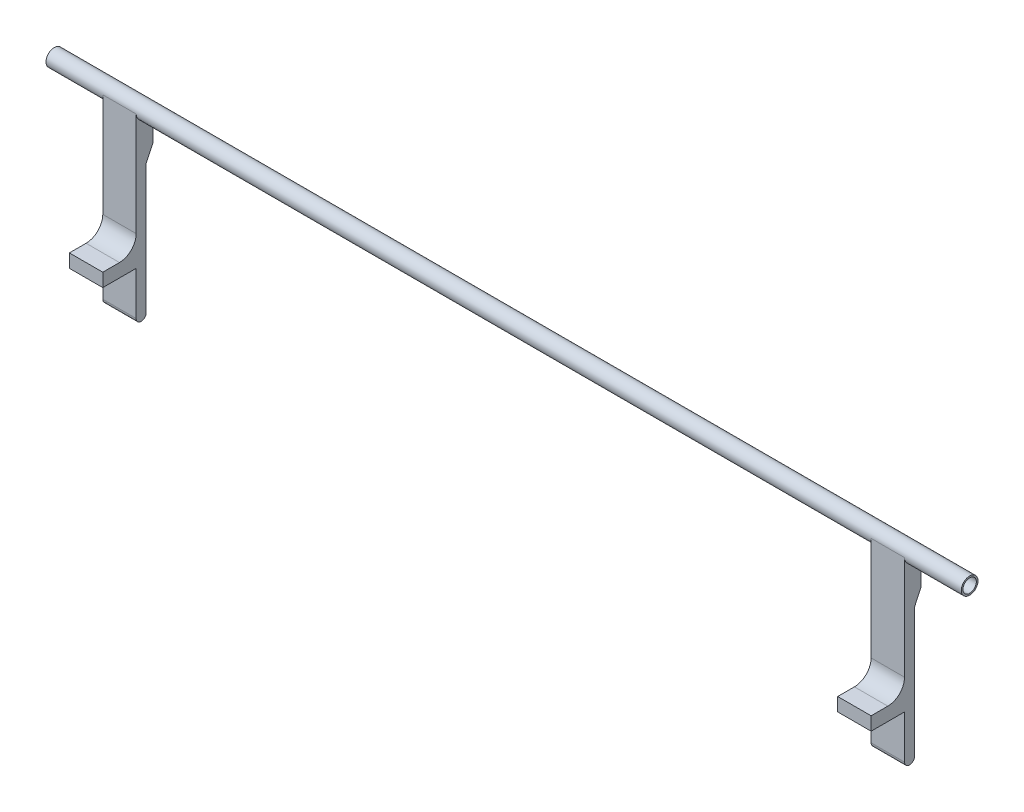
ISO-10303-21;
HEADER;
FILE_DESCRIPTION(('STEP AP214'),'2;1');
FILE_NAME('part.step','',(''),(''),'','','');
FILE_SCHEMA(('AUTOMOTIVE_DESIGN { 1 0 10303 214 1 1 1 1 }'));
ENDSEC;
DATA;
#1=APPLICATION_CONTEXT('core data for automotive mechanical design processes');
#2=APPLICATION_PROTOCOL_DEFINITION('international standard','automotive_design',2000,#1);
#3=PRODUCT_CONTEXT('',#1,'mechanical');
#4=PRODUCT('Part','Part','',(#3));
#5=PRODUCT_RELATED_PRODUCT_CATEGORY('part','',(#4));
#6=PRODUCT_DEFINITION_FORMATION('','',#4);
#7=PRODUCT_DEFINITION_CONTEXT('part definition',#1,'design');
#8=PRODUCT_DEFINITION('design','',#6,#7);
#9=PRODUCT_DEFINITION_SHAPE('','',#8);
#10=(LENGTH_UNIT() NAMED_UNIT(*) SI_UNIT(.MILLI.,.METRE.));
#11=(NAMED_UNIT(*) PLANE_ANGLE_UNIT() SI_UNIT($,.RADIAN.));
#12=(NAMED_UNIT(*) SI_UNIT($,.STERADIAN.) SOLID_ANGLE_UNIT());
#13=UNCERTAINTY_MEASURE_WITH_UNIT(LENGTH_MEASURE(1.E-05),#10,'distance_accuracy_value','');
#14=(GEOMETRIC_REPRESENTATION_CONTEXT(3) GLOBAL_UNCERTAINTY_ASSIGNED_CONTEXT((#13)) GLOBAL_UNIT_ASSIGNED_CONTEXT((#10,
#11,#12)) REPRESENTATION_CONTEXT('',''));
#15=CARTESIAN_POINT('',(0.,0.,0.));
#16=DIRECTION('',(0.,0.,1.));
#17=DIRECTION('',(1.,0.,0.));
#18=AXIS2_PLACEMENT_3D('',#15,#16,#17);
#19=CARTESIAN_POINT('',(137.,0.,0.));
#20=DIRECTION('',(-1.,0.,0.));
#21=DIRECTION('',(0.,0.,1.));
#22=AXIS2_PLACEMENT_3D('',#19,#20,#21);
#23=CYLINDRICAL_SURFACE('',#22,2.5);
#24=CARTESIAN_POINT('',(110.,0.,0.));
#25=DIRECTION('',(-1.,0.,0.));
#26=DIRECTION('',(0.,0.,-1.));
#27=AXIS2_PLACEMENT_3D('',#24,#25,#26);
#28=CIRCLE('',#27,2.5);
#29=CARTESIAN_POINT('',(110.,0.,-2.5));
#30=VERTEX_POINT('',#29);
#31=CARTESIAN_POINT('',(110.,0.,2.5));
#32=VERTEX_POINT('',#31);
#33=EDGE_CURVE('E274',#30,#32,#28,.T.);
#34=ORIENTED_EDGE('',*,*,#33,.T.);
#35=DIRECTION('',(1.,0.,0.));
#36=VECTOR('',#35,1.);
#37=CARTESIAN_POINT('',(110.,0.,2.5));
#38=LINE('',#37,#36);
#39=CARTESIAN_POINT('',(120.,0.,2.5));
#40=VERTEX_POINT('',#39);
#41=EDGE_CURVE('E307',#32,#40,#38,.T.);
#42=ORIENTED_EDGE('',*,*,#41,.T.);
#43=CARTESIAN_POINT('',(120.,0.,0.));
#44=DIRECTION('',(-1.,0.,0.));
#45=DIRECTION('',(0.,0.,-1.));
#46=AXIS2_PLACEMENT_3D('',#43,#44,#45);
#47=CIRCLE('',#46,2.5);
#48=CARTESIAN_POINT('',(120.,0.,-2.5));
#49=VERTEX_POINT('',#48);
#50=EDGE_CURVE('E248',#49,#40,#47,.T.);
#51=ORIENTED_EDGE('',*,*,#50,.F.);
#52=DIRECTION('',(1.,0.,0.));
#53=VECTOR('',#52,1.);
#54=CARTESIAN_POINT('',(110.,0.,-2.5));
#55=LINE('',#54,#53);
#56=EDGE_CURVE('E336',#30,#49,#55,.T.);
#57=ORIENTED_EDGE('',*,*,#56,.F.);
#58=EDGE_LOOP('',(#34,#42,#51,#57));
#59=FACE_BOUND('',#58,.T.);
#60=CARTESIAN_POINT('',(137.,0.,0.));
#61=DIRECTION('',(1.,0.,0.));
#62=DIRECTION('',(0.,0.,-1.));
#63=AXIS2_PLACEMENT_3D('',#60,#61,#62);
#64=CIRCLE('',#63,2.5);
#65=CARTESIAN_POINT('',(137.,0.,-2.5));
#66=VERTEX_POINT('',#65);
#67=EDGE_CURVE('E11',#66,#66,#64,.T.);
#68=ORIENTED_EDGE('',*,*,#67,.F.);
#69=EDGE_LOOP('',(#68));
#70=FACE_BOUND('',#69,.T.);
#71=CARTESIAN_POINT('',(-137.,0.,0.));
#72=DIRECTION('',(1.,0.,0.));
#73=DIRECTION('',(0.,0.,-1.));
#74=AXIS2_PLACEMENT_3D('',#71,#72,#73);
#75=CIRCLE('',#74,2.5);
#76=CARTESIAN_POINT('',(-137.,0.,-2.5));
#77=VERTEX_POINT('',#76);
#78=EDGE_CURVE('E39',#77,#77,#75,.T.);
#79=ORIENTED_EDGE('',*,*,#78,.T.);
#80=EDGE_LOOP('',(#79));
#81=FACE_BOUND('',#80,.T.);
#82=CARTESIAN_POINT('',(-110.,0.,0.));
#83=DIRECTION('',(-1.,0.,0.));
#84=DIRECTION('',(0.,0.,-1.));
#85=AXIS2_PLACEMENT_3D('',#82,#83,#84);
#86=CIRCLE('',#85,2.5);
#87=CARTESIAN_POINT('',(-110.,0.,-2.5));
#88=VERTEX_POINT('',#87);
#89=CARTESIAN_POINT('',(-110.,0.,2.5));
#90=VERTEX_POINT('',#89);
#91=EDGE_CURVE('E190',#88,#90,#86,.T.);
#92=ORIENTED_EDGE('',*,*,#91,.F.);
#93=DIRECTION('',(-1.,0.,0.));
#94=VECTOR('',#93,1.);
#95=CARTESIAN_POINT('',(-110.,0.,-2.5));
#96=LINE('',#95,#94);
#97=CARTESIAN_POINT('',(-120.,0.,-2.5));
#98=VERTEX_POINT('',#97);
#99=EDGE_CURVE('E198',#88,#98,#96,.T.);
#100=ORIENTED_EDGE('',*,*,#99,.T.);
#101=CARTESIAN_POINT('',(-120.,0.,0.));
#102=DIRECTION('',(-1.,0.,0.));
#103=DIRECTION('',(0.,0.,-1.));
#104=AXIS2_PLACEMENT_3D('',#101,#102,#103);
#105=CIRCLE('',#104,2.5);
#106=CARTESIAN_POINT('',(-120.,0.,2.5));
#107=VERTEX_POINT('',#106);
#108=EDGE_CURVE('E229',#98,#107,#105,.T.);
#109=ORIENTED_EDGE('',*,*,#108,.T.);
#110=DIRECTION('',(-1.,0.,0.));
#111=VECTOR('',#110,1.);
#112=CARTESIAN_POINT('',(-110.,0.,2.5));
#113=LINE('',#112,#111);
#114=EDGE_CURVE('E50',#90,#107,#113,.T.);
#115=ORIENTED_EDGE('',*,*,#114,.F.);
#116=EDGE_LOOP('',(#92,#100,#109,#115));
#117=FACE_BOUND('',#116,.T.);
#118=ADVANCED_FACE('F36',(#59,#70,#81,#117),#23,.T.);
#119=CARTESIAN_POINT('',(137.,0.,0.));
#120=DIRECTION('',(1.,0.,0.));
#121=DIRECTION('',(0.,0.,-1.));
#122=AXIS2_PLACEMENT_3D('',#119,#120,#121);
#123=PLANE('',#122);
#124=ORIENTED_EDGE('',*,*,#67,.T.);
#125=EDGE_LOOP('',(#124));
#126=FACE_BOUND('',#125,.T.);
#127=CARTESIAN_POINT('',(137.,0.,0.));
#128=DIRECTION('',(1.,0.,0.));
#129=DIRECTION('',(0.,0.,-1.));
#130=AXIS2_PLACEMENT_3D('',#127,#128,#129);
#131=CIRCLE('',#130,2.);
#132=CARTESIAN_POINT('',(137.,0.,-2.));
#133=VERTEX_POINT('',#132);
#134=EDGE_CURVE('E359',#133,#133,#131,.T.);
#135=ORIENTED_EDGE('',*,*,#134,.F.);
#136=EDGE_LOOP('',(#135));
#137=FACE_BOUND('',#136,.T.);
#138=ADVANCED_FACE('F379',(#126,#137),#123,.T.);
#139=CARTESIAN_POINT('',(-137.,0.,0.));
#140=DIRECTION('',(1.,0.,0.));
#141=DIRECTION('',(0.,0.,-1.));
#142=AXIS2_PLACEMENT_3D('',#139,#140,#141);
#143=PLANE('',#142);
#144=ORIENTED_EDGE('',*,*,#78,.F.);
#145=EDGE_LOOP('',(#144));
#146=FACE_BOUND('',#145,.T.);
#147=CARTESIAN_POINT('',(-137.,0.,0.));
#148=DIRECTION('',(1.,0.,0.));
#149=DIRECTION('',(0.,0.,-1.));
#150=AXIS2_PLACEMENT_3D('',#147,#148,#149);
#151=CIRCLE('',#150,2.);
#152=CARTESIAN_POINT('',(-137.,0.,-2.));
#153=VERTEX_POINT('',#152);
#154=EDGE_CURVE('E338',#153,#153,#151,.T.);
#155=ORIENTED_EDGE('',*,*,#154,.T.);
#156=EDGE_LOOP('',(#155));
#157=FACE_BOUND('',#156,.T.);
#158=ADVANCED_FACE('F365',(#146,#157),#143,.F.);
#159=CARTESIAN_POINT('',(137.,0.,0.));
#160=DIRECTION('',(-1.,0.,0.));
#161=DIRECTION('',(0.,0.,1.));
#162=AXIS2_PLACEMENT_3D('',#159,#160,#161);
#163=CYLINDRICAL_SURFACE('',#162,2.);
#164=ORIENTED_EDGE('',*,*,#134,.T.);
#165=EDGE_LOOP('',(#164));
#166=FACE_BOUND('',#165,.T.);
#167=ORIENTED_EDGE('',*,*,#154,.F.);
#168=EDGE_LOOP('',(#167));
#169=FACE_BOUND('',#168,.T.);
#170=ADVANCED_FACE('F367',(#166,#169),#163,.F.);
#171=CARTESIAN_POINT('',(110.,0.,-2.5));
#172=DIRECTION('',(0.,0.,-1.));
#173=DIRECTION('',(0.,1.,0.));
#174=AXIS2_PLACEMENT_3D('',#171,#172,#173);
#175=PLANE('',#174);
#176=DIRECTION('',(0.,1.,0.));
#177=VECTOR('',#176,1.);
#178=CARTESIAN_POINT('',(120.,0.,-2.5));
#179=LINE('',#178,#177);
#180=CARTESIAN_POINT('',(120.,-10.,-2.5));
#181=VERTEX_POINT('',#180);
#182=EDGE_CURVE('E58',#181,#49,#179,.T.);
#183=ORIENTED_EDGE('',*,*,#182,.F.);
#184=DIRECTION('',(1.,0.,0.));
#185=VECTOR('',#184,1.);
#186=CARTESIAN_POINT('',(110.,-10.,-2.5));
#187=LINE('',#186,#185);
#188=CARTESIAN_POINT('',(110.,-10.,-2.5));
#189=VERTEX_POINT('',#188);
#190=EDGE_CURVE('E339',#189,#181,#187,.T.);
#191=ORIENTED_EDGE('',*,*,#190,.F.);
#192=DIRECTION('',(0.,1.,0.));
#193=VECTOR('',#192,1.);
#194=CARTESIAN_POINT('',(110.,0.,-2.5));
#195=LINE('',#194,#193);
#196=EDGE_CURVE('E304',#189,#30,#195,.T.);
#197=ORIENTED_EDGE('',*,*,#196,.T.);
#198=ORIENTED_EDGE('',*,*,#56,.T.);
#199=EDGE_LOOP('',(#183,#191,#197,#198));
#200=FACE_BOUND('',#199,.T.);
#201=ADVANCED_FACE('F369',(#200),#175,.T.);
#202=CARTESIAN_POINT('',(110.,-10.,-2.5));
#203=DIRECTION('',(0.,-0.4226182617407,-0.90630778703665));
#204=DIRECTION('',(0.,0.90630778703665,-0.4226182617407));
#205=AXIS2_PLACEMENT_3D('',#202,#203,#204);
#206=PLANE('',#205);
#207=DIRECTION('',(0.,0.90630778703665,-0.4226182617407));
#208=VECTOR('',#207,1.);
#209=CARTESIAN_POINT('',(120.,-10.,-2.5));
#210=LINE('',#209,#208);
#211=CARTESIAN_POINT('',(120.,-14.2890138410191,-0.499999999999998));
#212=VERTEX_POINT('',#211);
#213=EDGE_CURVE('E333',#212,#181,#210,.T.);
#214=ORIENTED_EDGE('',*,*,#213,.F.);
#215=DIRECTION('',(1.,0.,0.));
#216=VECTOR('',#215,1.);
#217=CARTESIAN_POINT('',(110.,-14.2890138410191,-0.499999999999998));
#218=LINE('',#217,#216);
#219=CARTESIAN_POINT('',(110.,-14.2890138410191,-0.499999999999998));
#220=VERTEX_POINT('',#219);
#221=EDGE_CURVE('E341',#220,#212,#218,.T.);
#222=ORIENTED_EDGE('',*,*,#221,.F.);
#223=DIRECTION('',(0.,0.90630778703665,-0.4226182617407));
#224=VECTOR('',#223,1.);
#225=CARTESIAN_POINT('',(110.,-10.,-2.5));
#226=LINE('',#225,#224);
#227=EDGE_CURVE('E301',#220,#189,#226,.T.);
#228=ORIENTED_EDGE('',*,*,#227,.T.);
#229=ORIENTED_EDGE('',*,*,#190,.T.);
#230=EDGE_LOOP('',(#214,#222,#228,#229));
#231=FACE_BOUND('',#230,.T.);
#232=ADVANCED_FACE('F376',(#231),#206,.T.);
#233=CARTESIAN_POINT('',(110.,-14.2890138410191,-0.499999999999998));
#234=DIRECTION('',(0.,0.,-1.));
#235=DIRECTION('',(0.,1.,0.));
#236=AXIS2_PLACEMENT_3D('',#233,#234,#235);
#237=PLANE('',#236);
#238=DIRECTION('',(0.,1.,0.));
#239=VECTOR('',#238,1.);
#240=CARTESIAN_POINT('',(120.,-14.2890138410191,-0.499999999999998));
#241=LINE('',#240,#239);
#242=CARTESIAN_POINT('',(120.,-53.,-0.500000000000007));
#243=VERTEX_POINT('',#242);
#244=EDGE_CURVE('E330',#243,#212,#241,.T.);
#245=ORIENTED_EDGE('',*,*,#244,.F.);
#246=DIRECTION('',(1.,0.,0.));
#247=VECTOR('',#246,1.);
#248=CARTESIAN_POINT('',(110.,-53.,-0.500000000000007));
#249=LINE('',#248,#247);
#250=CARTESIAN_POINT('',(110.,-53.,-0.500000000000007));
#251=VERTEX_POINT('',#250);
#252=EDGE_CURVE('E343',#251,#243,#249,.T.);
#253=ORIENTED_EDGE('',*,*,#252,.F.);
#254=DIRECTION('',(0.,1.,0.));
#255=VECTOR('',#254,1.);
#256=CARTESIAN_POINT('',(110.,-14.2890138410191,-0.499999999999998));
#257=LINE('',#256,#255);
#258=EDGE_CURVE('E298',#251,#220,#257,.T.);
#259=ORIENTED_EDGE('',*,*,#258,.T.);
#260=ORIENTED_EDGE('',*,*,#221,.T.);
#261=EDGE_LOOP('',(#245,#253,#259,#260));
#262=FACE_BOUND('',#261,.T.);
#263=ADVANCED_FACE('F410',(#262),#237,.T.);
#264=CARTESIAN_POINT('',(110.,-53.,0.999999999999993));
#265=DIRECTION('',(1.,0.,0.));
#266=DIRECTION('',(0.,0.,-1.));
#267=AXIS2_PLACEMENT_3D('',#264,#265,#266);
#268=CYLINDRICAL_SURFACE('',#267,1.5);
#269=CARTESIAN_POINT('',(120.,-53.,0.999999999999993));
#270=DIRECTION('',(1.,0.,0.));
#271=DIRECTION('',(0.,0.,1.));
#272=AXIS2_PLACEMENT_3D('',#269,#270,#271);
#273=CIRCLE('',#272,1.5);
#274=CARTESIAN_POINT('',(120.,-53.,2.49999999999999));
#275=VERTEX_POINT('',#274);
#276=EDGE_CURVE('E327',#275,#243,#273,.T.);
#277=ORIENTED_EDGE('',*,*,#276,.F.);
#278=DIRECTION('',(1.,0.,0.));
#279=VECTOR('',#278,1.);
#280=CARTESIAN_POINT('',(110.,-53.,2.49999999999999));
#281=LINE('',#280,#279);
#282=CARTESIAN_POINT('',(110.,-53.,2.49999999999999));
#283=VERTEX_POINT('',#282);
#284=EDGE_CURVE('E345',#283,#275,#281,.T.);
#285=ORIENTED_EDGE('',*,*,#284,.F.);
#286=CARTESIAN_POINT('',(110.,-53.,0.999999999999993));
#287=DIRECTION('',(1.,0.,0.));
#288=DIRECTION('',(0.,0.,1.));
#289=AXIS2_PLACEMENT_3D('',#286,#287,#288);
#290=CIRCLE('',#289,1.5);
#291=EDGE_CURVE('E295',#283,#251,#290,.T.);
#292=ORIENTED_EDGE('',*,*,#291,.T.);
#293=ORIENTED_EDGE('',*,*,#252,.T.);
#294=EDGE_LOOP('',(#277,#285,#292,#293));
#295=FACE_BOUND('',#294,.T.);
#296=ADVANCED_FACE('F413',(#295),#268,.T.);
#297=CARTESIAN_POINT('',(110.,-53.,2.49999999999999));
#298=DIRECTION('',(0.,0.,1.));
#299=DIRECTION('',(0.,-1.,0.));
#300=AXIS2_PLACEMENT_3D('',#297,#298,#299);
#301=PLANE('',#300);
#302=DIRECTION('',(0.,-1.,0.));
#303=VECTOR('',#302,1.);
#304=CARTESIAN_POINT('',(120.,-53.,2.49999999999999));
#305=LINE('',#304,#303);
#306=CARTESIAN_POINT('',(120.,-40.,2.5));
#307=VERTEX_POINT('',#306);
#308=EDGE_CURVE('E324',#307,#275,#305,.T.);
#309=ORIENTED_EDGE('',*,*,#308,.F.);
#310=DIRECTION('',(1.,0.,0.));
#311=VECTOR('',#310,1.);
#312=CARTESIAN_POINT('',(110.,-40.,2.5));
#313=LINE('',#312,#311);
#314=CARTESIAN_POINT('',(110.,-40.,2.5));
#315=VERTEX_POINT('',#314);
#316=EDGE_CURVE('E347',#315,#307,#313,.T.);
#317=ORIENTED_EDGE('',*,*,#316,.F.);
#318=DIRECTION('',(0.,-1.,0.));
#319=VECTOR('',#318,1.);
#320=CARTESIAN_POINT('',(110.,-53.,2.49999999999999));
#321=LINE('',#320,#319);
#322=EDGE_CURVE('E292',#315,#283,#321,.T.);
#323=ORIENTED_EDGE('',*,*,#322,.T.);
#324=ORIENTED_EDGE('',*,*,#284,.T.);
#325=EDGE_LOOP('',(#309,#317,#323,#324));
#326=FACE_BOUND('',#325,.T.);
#327=ADVANCED_FACE('F418',(#326),#301,.T.);
#328=CARTESIAN_POINT('',(110.,-40.,2.5));
#329=DIRECTION('',(0.,-1.,0.));
#330=DIRECTION('',(0.,0.,-1.));
#331=AXIS2_PLACEMENT_3D('',#328,#329,#330);
#332=PLANE('',#331);
#333=DIRECTION('',(0.,0.,-1.));
#334=VECTOR('',#333,1.);
#335=CARTESIAN_POINT('',(120.,-40.,2.5));
#336=LINE('',#335,#334);
#337=CARTESIAN_POINT('',(120.,-40.,12.5));
#338=VERTEX_POINT('',#337);
#339=EDGE_CURVE('E321',#338,#307,#336,.T.);
#340=ORIENTED_EDGE('',*,*,#339,.F.);
#341=DIRECTION('',(1.,0.,0.));
#342=VECTOR('',#341,1.);
#343=CARTESIAN_POINT('',(110.,-40.,12.5));
#344=LINE('',#343,#342);
#345=CARTESIAN_POINT('',(110.,-40.,12.5));
#346=VERTEX_POINT('',#345);
#347=EDGE_CURVE('E349',#346,#338,#344,.T.);
#348=ORIENTED_EDGE('',*,*,#347,.F.);
#349=DIRECTION('',(0.,0.,-1.));
#350=VECTOR('',#349,1.);
#351=CARTESIAN_POINT('',(110.,-40.,2.5));
#352=LINE('',#351,#350);
#353=EDGE_CURVE('E289',#346,#315,#352,.T.);
#354=ORIENTED_EDGE('',*,*,#353,.T.);
#355=ORIENTED_EDGE('',*,*,#316,.T.);
#356=EDGE_LOOP('',(#340,#348,#354,#355));
#357=FACE_BOUND('',#356,.T.);
#358=ADVANCED_FACE('F421',(#357),#332,.T.);
#359=CARTESIAN_POINT('',(110.,-40.,12.5));
#360=DIRECTION('',(0.,0.,1.));
#361=DIRECTION('',(1.,0.,0.));
#362=AXIS2_PLACEMENT_3D('',#359,#360,#361);
#363=PLANE('',#362);
#364=DIRECTION('',(0.,-1.,0.));
#365=VECTOR('',#364,1.);
#366=CARTESIAN_POINT('',(120.,-40.,12.5));
#367=LINE('',#366,#365);
#368=CARTESIAN_POINT('',(120.,-36.,12.5));
#369=VERTEX_POINT('',#368);
#370=EDGE_CURVE('E318',#369,#338,#367,.T.);
#371=ORIENTED_EDGE('',*,*,#370,.F.);
#372=DIRECTION('',(1.,0.,0.));
#373=VECTOR('',#372,1.);
#374=CARTESIAN_POINT('',(110.,-36.,12.5));
#375=LINE('',#374,#373);
#376=CARTESIAN_POINT('',(110.,-36.,12.5));
#377=VERTEX_POINT('',#376);
#378=EDGE_CURVE('E351',#377,#369,#375,.T.);
#379=ORIENTED_EDGE('',*,*,#378,.F.);
#380=DIRECTION('',(0.,-1.,0.));
#381=VECTOR('',#380,1.);
#382=CARTESIAN_POINT('',(110.,-40.,12.5));
#383=LINE('',#382,#381);
#384=EDGE_CURVE('E286',#377,#346,#383,.T.);
#385=ORIENTED_EDGE('',*,*,#384,.T.);
#386=ORIENTED_EDGE('',*,*,#347,.T.);
#387=EDGE_LOOP('',(#371,#379,#385,#386));
#388=FACE_BOUND('',#387,.T.);
#389=ADVANCED_FACE('F426',(#388),#363,.T.);
#390=CARTESIAN_POINT('',(110.,-36.,12.5));
#391=DIRECTION('',(0.,1.,0.));
#392=DIRECTION('',(0.,0.,1.));
#393=AXIS2_PLACEMENT_3D('',#390,#391,#392);
#394=PLANE('',#393);
#395=DIRECTION('',(0.,0.,1.));
#396=VECTOR('',#395,1.);
#397=CARTESIAN_POINT('',(120.,-36.,12.5));
#398=LINE('',#397,#396);
#399=CARTESIAN_POINT('',(120.,-36.,7.5));
#400=VERTEX_POINT('',#399);
#401=EDGE_CURVE('E315',#400,#369,#398,.T.);
#402=ORIENTED_EDGE('',*,*,#401,.F.);
#403=DIRECTION('',(1.,0.,0.));
#404=VECTOR('',#403,1.);
#405=CARTESIAN_POINT('',(110.,-36.,7.5));
#406=LINE('',#405,#404);
#407=CARTESIAN_POINT('',(110.,-36.,7.5));
#408=VERTEX_POINT('',#407);
#409=EDGE_CURVE('E353',#408,#400,#406,.T.);
#410=ORIENTED_EDGE('',*,*,#409,.F.);
#411=DIRECTION('',(0.,0.,1.));
#412=VECTOR('',#411,1.);
#413=CARTESIAN_POINT('',(110.,-36.,12.5));
#414=LINE('',#413,#412);
#415=EDGE_CURVE('E283',#408,#377,#414,.T.);
#416=ORIENTED_EDGE('',*,*,#415,.T.);
#417=ORIENTED_EDGE('',*,*,#378,.T.);
#418=EDGE_LOOP('',(#402,#410,#416,#417));
#419=FACE_BOUND('',#418,.T.);
#420=ADVANCED_FACE('F429',(#419),#394,.T.);
#421=CARTESIAN_POINT('',(110.,-31.,7.5));
#422=DIRECTION('',(1.,0.,0.));
#423=DIRECTION('',(0.,0.,-1.));
#424=AXIS2_PLACEMENT_3D('',#421,#422,#423);
#425=CYLINDRICAL_SURFACE('',#424,5.);
#426=CARTESIAN_POINT('',(120.,-31.,7.5));
#427=DIRECTION('',(-1.,0.,0.));
#428=DIRECTION('',(0.,0.,1.));
#429=AXIS2_PLACEMENT_3D('',#426,#427,#428);
#430=CIRCLE('',#429,5.);
#431=CARTESIAN_POINT('',(120.,-31.,2.5));
#432=VERTEX_POINT('',#431);
#433=EDGE_CURVE('E312',#432,#400,#430,.T.);
#434=ORIENTED_EDGE('',*,*,#433,.F.);
#435=DIRECTION('',(1.,0.,0.));
#436=VECTOR('',#435,1.);
#437=CARTESIAN_POINT('',(110.,-31.,2.5));
#438=LINE('',#437,#436);
#439=CARTESIAN_POINT('',(110.,-31.,2.5));
#440=VERTEX_POINT('',#439);
#441=EDGE_CURVE('E355',#440,#432,#438,.T.);
#442=ORIENTED_EDGE('',*,*,#441,.F.);
#443=CARTESIAN_POINT('',(110.,-31.,7.5));
#444=DIRECTION('',(-1.,0.,0.));
#445=DIRECTION('',(0.,0.,1.));
#446=AXIS2_PLACEMENT_3D('',#443,#444,#445);
#447=CIRCLE('',#446,5.);
#448=EDGE_CURVE('E280',#440,#408,#447,.T.);
#449=ORIENTED_EDGE('',*,*,#448,.T.);
#450=ORIENTED_EDGE('',*,*,#409,.T.);
#451=EDGE_LOOP('',(#434,#442,#449,#450));
#452=FACE_BOUND('',#451,.T.);
#453=ADVANCED_FACE('F432',(#452),#425,.F.);
#454=CARTESIAN_POINT('',(110.,0.,2.5));
#455=DIRECTION('',(0.,0.,1.));
#456=DIRECTION('',(0.,-1.,0.));
#457=AXIS2_PLACEMENT_3D('',#454,#455,#456);
#458=PLANE('',#457);
#459=DIRECTION('',(0.,-1.,0.));
#460=VECTOR('',#459,1.);
#461=CARTESIAN_POINT('',(120.,0.,2.5));
#462=LINE('',#461,#460);
#463=EDGE_CURVE('E309',#40,#432,#462,.T.);
#464=ORIENTED_EDGE('',*,*,#463,.F.);
#465=ORIENTED_EDGE('',*,*,#41,.F.);
#466=DIRECTION('',(0.,-1.,0.));
#467=VECTOR('',#466,1.);
#468=CARTESIAN_POINT('',(110.,0.,2.5));
#469=LINE('',#468,#467);
#470=EDGE_CURVE('E277',#32,#440,#469,.T.);
#471=ORIENTED_EDGE('',*,*,#470,.T.);
#472=ORIENTED_EDGE('',*,*,#441,.T.);
#473=EDGE_LOOP('',(#464,#465,#471,#472));
#474=FACE_BOUND('',#473,.T.);
#475=ADVANCED_FACE('F434',(#474),#458,.T.);
#476=CARTESIAN_POINT('',(110.,0.,0.));
#477=DIRECTION('',(1.,0.,0.));
#478=DIRECTION('',(0.,0.,-1.));
#479=AXIS2_PLACEMENT_3D('',#476,#477,#478);
#480=PLANE('',#479);
#481=ORIENTED_EDGE('',*,*,#33,.F.);
#482=ORIENTED_EDGE('',*,*,#196,.F.);
#483=ORIENTED_EDGE('',*,*,#227,.F.);
#484=ORIENTED_EDGE('',*,*,#258,.F.);
#485=ORIENTED_EDGE('',*,*,#291,.F.);
#486=ORIENTED_EDGE('',*,*,#322,.F.);
#487=ORIENTED_EDGE('',*,*,#353,.F.);
#488=ORIENTED_EDGE('',*,*,#384,.F.);
#489=ORIENTED_EDGE('',*,*,#415,.F.);
#490=ORIENTED_EDGE('',*,*,#448,.F.);
#491=ORIENTED_EDGE('',*,*,#470,.F.);
#492=EDGE_LOOP('',(#481,#482,#483,#484,#485,#486,#487,#488,#489,#490,#491));
#493=FACE_BOUND('',#492,.T.);
#494=ADVANCED_FACE('F401',(#493),#480,.F.);
#495=CARTESIAN_POINT('',(120.,0.,0.));
#496=DIRECTION('',(1.,0.,0.));
#497=DIRECTION('',(0.,0.,-1.));
#498=AXIS2_PLACEMENT_3D('',#495,#496,#497);
#499=PLANE('',#498);
#500=ORIENTED_EDGE('',*,*,#50,.T.);
#501=ORIENTED_EDGE('',*,*,#463,.T.);
#502=ORIENTED_EDGE('',*,*,#433,.T.);
#503=ORIENTED_EDGE('',*,*,#401,.T.);
#504=ORIENTED_EDGE('',*,*,#370,.T.);
#505=ORIENTED_EDGE('',*,*,#339,.T.);
#506=ORIENTED_EDGE('',*,*,#308,.T.);
#507=ORIENTED_EDGE('',*,*,#276,.T.);
#508=ORIENTED_EDGE('',*,*,#244,.T.);
#509=ORIENTED_EDGE('',*,*,#213,.T.);
#510=ORIENTED_EDGE('',*,*,#182,.T.);
#511=EDGE_LOOP('',(#500,#501,#502,#503,#504,#505,#506,#507,#508,#509,#510));
#512=FACE_BOUND('',#511,.T.);
#513=ADVANCED_FACE('F435',(#512),#499,.T.);
#514=CARTESIAN_POINT('',(-110.,0.,2.5));
#515=DIRECTION('',(0.,0.,-1.));
#516=DIRECTION('',(0.,1.,0.));
#517=AXIS2_PLACEMENT_3D('',#514,#515,#516);
#518=PLANE('',#517);
#519=DIRECTION('',(0.,-1.,0.));
#520=VECTOR('',#519,1.);
#521=CARTESIAN_POINT('',(-120.,0.,2.5));
#522=LINE('',#521,#520);
#523=CARTESIAN_POINT('',(-120.,-31.,2.5));
#524=VERTEX_POINT('',#523);
#525=EDGE_CURVE('E208',#107,#524,#522,.T.);
#526=ORIENTED_EDGE('',*,*,#525,.T.);
#527=DIRECTION('',(-1.,0.,0.));
#528=VECTOR('',#527,1.);
#529=CARTESIAN_POINT('',(-110.,-31.,2.5));
#530=LINE('',#529,#528);
#531=CARTESIAN_POINT('',(-110.,-31.,2.5));
#532=VERTEX_POINT('',#531);
#533=EDGE_CURVE('E249',#532,#524,#530,.T.);
#534=ORIENTED_EDGE('',*,*,#533,.F.);
#535=DIRECTION('',(0.,-1.,0.));
#536=VECTOR('',#535,1.);
#537=CARTESIAN_POINT('',(-110.,0.,2.5));
#538=LINE('',#537,#536);
#539=EDGE_CURVE('E206',#90,#532,#538,.T.);
#540=ORIENTED_EDGE('',*,*,#539,.F.);
#541=ORIENTED_EDGE('',*,*,#114,.T.);
#542=EDGE_LOOP('',(#526,#534,#540,#541));
#543=FACE_BOUND('',#542,.T.);
#544=ADVANCED_FACE('F437',(#543),#518,.F.);
#545=CARTESIAN_POINT('',(-110.,-31.,7.5));
#546=DIRECTION('',(-1.,0.,0.));
#547=DIRECTION('',(0.,0.,1.));
#548=AXIS2_PLACEMENT_3D('',#545,#546,#547);
#549=CYLINDRICAL_SURFACE('',#548,5.);
#550=CARTESIAN_POINT('',(-120.,-31.,7.5));
#551=DIRECTION('',(-1.,0.,0.));
#552=DIRECTION('',(0.,0.,1.));
#553=AXIS2_PLACEMENT_3D('',#550,#551,#552);
#554=CIRCLE('',#553,5.);
#555=CARTESIAN_POINT('',(-120.,-36.,7.5));
#556=VERTEX_POINT('',#555);
#557=EDGE_CURVE('E210',#524,#556,#554,.T.);
#558=ORIENTED_EDGE('',*,*,#557,.T.);
#559=DIRECTION('',(-1.,0.,0.));
#560=VECTOR('',#559,1.);
#561=CARTESIAN_POINT('',(-110.,-36.,7.5));
#562=LINE('',#561,#560);
#563=CARTESIAN_POINT('',(-110.,-36.,7.5));
#564=VERTEX_POINT('',#563);
#565=EDGE_CURVE('E252',#564,#556,#562,.T.);
#566=ORIENTED_EDGE('',*,*,#565,.F.);
#567=CARTESIAN_POINT('',(-110.,-31.,7.5));
#568=DIRECTION('',(-1.,0.,0.));
#569=DIRECTION('',(0.,0.,1.));
#570=AXIS2_PLACEMENT_3D('',#567,#568,#569);
#571=CIRCLE('',#570,5.);
#572=EDGE_CURVE('E226',#532,#564,#571,.T.);
#573=ORIENTED_EDGE('',*,*,#572,.F.);
#574=ORIENTED_EDGE('',*,*,#533,.T.);
#575=EDGE_LOOP('',(#558,#566,#573,#574));
#576=FACE_BOUND('',#575,.T.);
#577=ADVANCED_FACE('F443',(#576),#549,.F.);
#578=CARTESIAN_POINT('',(-110.,-36.,12.5));
#579=DIRECTION('',(0.,-1.,0.));
#580=DIRECTION('',(0.,0.,-1.));
#581=AXIS2_PLACEMENT_3D('',#578,#579,#580);
#582=PLANE('',#581);
#583=DIRECTION('',(0.,0.,1.));
#584=VECTOR('',#583,1.);
#585=CARTESIAN_POINT('',(-120.,-36.,12.5));
#586=LINE('',#585,#584);
#587=CARTESIAN_POINT('',(-120.,-36.,12.5));
#588=VERTEX_POINT('',#587);
#589=EDGE_CURVE('E244',#556,#588,#586,.T.);
#590=ORIENTED_EDGE('',*,*,#589,.T.);
#591=DIRECTION('',(-1.,0.,0.));
#592=VECTOR('',#591,1.);
#593=CARTESIAN_POINT('',(-110.,-36.,12.5));
#594=LINE('',#593,#592);
#595=CARTESIAN_POINT('',(-110.,-36.,12.5));
#596=VERTEX_POINT('',#595);
#597=EDGE_CURVE('E255',#596,#588,#594,.T.);
#598=ORIENTED_EDGE('',*,*,#597,.F.);
#599=DIRECTION('',(0.,0.,1.));
#600=VECTOR('',#599,1.);
#601=CARTESIAN_POINT('',(-110.,-36.,12.5));
#602=LINE('',#601,#600);
#603=EDGE_CURVE('E224',#564,#596,#602,.T.);
#604=ORIENTED_EDGE('',*,*,#603,.F.);
#605=ORIENTED_EDGE('',*,*,#565,.T.);
#606=EDGE_LOOP('',(#590,#598,#604,#605));
#607=FACE_BOUND('',#606,.T.);
#608=ADVANCED_FACE('F495',(#607),#582,.F.);
#609=CARTESIAN_POINT('',(-110.,-40.,12.5));
#610=DIRECTION('',(0.,0.,-1.));
#611=DIRECTION('',(-1.,0.,0.));
#612=AXIS2_PLACEMENT_3D('',#609,#610,#611);
#613=PLANE('',#612);
#614=DIRECTION('',(0.,-1.,0.));
#615=VECTOR('',#614,1.);
#616=CARTESIAN_POINT('',(-120.,-40.,12.5));
#617=LINE('',#616,#615);
#618=CARTESIAN_POINT('',(-120.,-40.,12.5));
#619=VERTEX_POINT('',#618);
#620=EDGE_CURVE('E242',#588,#619,#617,.T.);
#621=ORIENTED_EDGE('',*,*,#620,.T.);
#622=DIRECTION('',(-1.,0.,0.));
#623=VECTOR('',#622,1.);
#624=CARTESIAN_POINT('',(-110.,-40.,12.5));
#625=LINE('',#624,#623);
#626=CARTESIAN_POINT('',(-110.,-40.,12.5));
#627=VERTEX_POINT('',#626);
#628=EDGE_CURVE('E258',#627,#619,#625,.T.);
#629=ORIENTED_EDGE('',*,*,#628,.F.);
#630=DIRECTION('',(0.,-1.,0.));
#631=VECTOR('',#630,1.);
#632=CARTESIAN_POINT('',(-110.,-40.,12.5));
#633=LINE('',#632,#631);
#634=EDGE_CURVE('E222',#596,#627,#633,.T.);
#635=ORIENTED_EDGE('',*,*,#634,.F.);
#636=ORIENTED_EDGE('',*,*,#597,.T.);
#637=EDGE_LOOP('',(#621,#629,#635,#636));
#638=FACE_BOUND('',#637,.T.);
#639=ADVANCED_FACE('F505',(#638),#613,.F.);
#640=CARTESIAN_POINT('',(-110.,-40.,2.5));
#641=DIRECTION('',(0.,1.,0.));
#642=DIRECTION('',(0.,0.,1.));
#643=AXIS2_PLACEMENT_3D('',#640,#641,#642);
#644=PLANE('',#643);
#645=DIRECTION('',(0.,0.,-1.));
#646=VECTOR('',#645,1.);
#647=CARTESIAN_POINT('',(-120.,-40.,2.5));
#648=LINE('',#647,#646);
#649=CARTESIAN_POINT('',(-120.,-40.,2.5));
#650=VERTEX_POINT('',#649);
#651=EDGE_CURVE('E240',#619,#650,#648,.T.);
#652=ORIENTED_EDGE('',*,*,#651,.T.);
#653=DIRECTION('',(-1.,0.,0.));
#654=VECTOR('',#653,1.);
#655=CARTESIAN_POINT('',(-110.,-40.,2.5));
#656=LINE('',#655,#654);
#657=CARTESIAN_POINT('',(-110.,-40.,2.5));
#658=VERTEX_POINT('',#657);
#659=EDGE_CURVE('E261',#658,#650,#656,.T.);
#660=ORIENTED_EDGE('',*,*,#659,.F.);
#661=DIRECTION('',(0.,0.,-1.));
#662=VECTOR('',#661,1.);
#663=CARTESIAN_POINT('',(-110.,-40.,2.5));
#664=LINE('',#663,#662);
#665=EDGE_CURVE('E220',#627,#658,#664,.T.);
#666=ORIENTED_EDGE('',*,*,#665,.F.);
#667=ORIENTED_EDGE('',*,*,#628,.T.);
#668=EDGE_LOOP('',(#652,#660,#666,#667));
#669=FACE_BOUND('',#668,.T.);
#670=ADVANCED_FACE('F515',(#669),#644,.F.);
#671=CARTESIAN_POINT('',(-110.,-53.,2.49999999999999));
#672=DIRECTION('',(0.,0.,-1.));
#673=DIRECTION('',(0.,1.,0.));
#674=AXIS2_PLACEMENT_3D('',#671,#672,#673);
#675=PLANE('',#674);
#676=DIRECTION('',(0.,-1.,0.));
#677=VECTOR('',#676,1.);
#678=CARTESIAN_POINT('',(-120.,-53.,2.49999999999999));
#679=LINE('',#678,#677);
#680=CARTESIAN_POINT('',(-120.,-53.,2.49999999999999));
#681=VERTEX_POINT('',#680);
#682=EDGE_CURVE('E238',#650,#681,#679,.T.);
#683=ORIENTED_EDGE('',*,*,#682,.T.);
#684=DIRECTION('',(-1.,0.,0.));
#685=VECTOR('',#684,1.);
#686=CARTESIAN_POINT('',(-110.,-53.,2.49999999999999));
#687=LINE('',#686,#685);
#688=CARTESIAN_POINT('',(-110.,-53.,2.49999999999999));
#689=VERTEX_POINT('',#688);
#690=EDGE_CURVE('E264',#689,#681,#687,.T.);
#691=ORIENTED_EDGE('',*,*,#690,.F.);
#692=DIRECTION('',(0.,-1.,0.));
#693=VECTOR('',#692,1.);
#694=CARTESIAN_POINT('',(-110.,-53.,2.49999999999999));
#695=LINE('',#694,#693);
#696=EDGE_CURVE('E218',#658,#689,#695,.T.);
#697=ORIENTED_EDGE('',*,*,#696,.F.);
#698=ORIENTED_EDGE('',*,*,#659,.T.);
#699=EDGE_LOOP('',(#683,#691,#697,#698));
#700=FACE_BOUND('',#699,.T.);
#701=ADVANCED_FACE('F525',(#700),#675,.F.);
#702=CARTESIAN_POINT('',(-110.,-53.,0.999999999999993));
#703=DIRECTION('',(-1.,0.,0.));
#704=DIRECTION('',(0.,0.,1.));
#705=AXIS2_PLACEMENT_3D('',#702,#703,#704);
#706=CYLINDRICAL_SURFACE('',#705,1.5);
#707=CARTESIAN_POINT('',(-120.,-53.,0.999999999999993));
#708=DIRECTION('',(1.,0.,0.));
#709=DIRECTION('',(0.,0.,1.));
#710=AXIS2_PLACEMENT_3D('',#707,#708,#709);
#711=CIRCLE('',#710,1.5);
#712=CARTESIAN_POINT('',(-120.,-53.,-0.500000000000007));
#713=VERTEX_POINT('',#712);
#714=EDGE_CURVE('E236',#681,#713,#711,.T.);
#715=ORIENTED_EDGE('',*,*,#714,.T.);
#716=DIRECTION('',(-1.,0.,0.));
#717=VECTOR('',#716,1.);
#718=CARTESIAN_POINT('',(-110.,-53.,-0.500000000000007));
#719=LINE('',#718,#717);
#720=CARTESIAN_POINT('',(-110.,-53.,-0.500000000000007));
#721=VERTEX_POINT('',#720);
#722=EDGE_CURVE('E267',#721,#713,#719,.T.);
#723=ORIENTED_EDGE('',*,*,#722,.F.);
#724=CARTESIAN_POINT('',(-110.,-53.,0.999999999999993));
#725=DIRECTION('',(1.,0.,0.));
#726=DIRECTION('',(0.,0.,1.));
#727=AXIS2_PLACEMENT_3D('',#724,#725,#726);
#728=CIRCLE('',#727,1.5);
#729=EDGE_CURVE('E216',#689,#721,#728,.T.);
#730=ORIENTED_EDGE('',*,*,#729,.F.);
#731=ORIENTED_EDGE('',*,*,#690,.T.);
#732=EDGE_LOOP('',(#715,#723,#730,#731));
#733=FACE_BOUND('',#732,.T.);
#734=ADVANCED_FACE('F535',(#733),#706,.T.);
#735=CARTESIAN_POINT('',(-110.,-14.2890138410191,-0.499999999999998));
#736=DIRECTION('',(0.,0.,1.));
#737=DIRECTION('',(0.,-1.,0.));
#738=AXIS2_PLACEMENT_3D('',#735,#736,#737);
#739=PLANE('',#738);
#740=DIRECTION('',(0.,1.,0.));
#741=VECTOR('',#740,1.);
#742=CARTESIAN_POINT('',(-120.,-14.2890138410191,-0.499999999999998));
#743=LINE('',#742,#741);
#744=CARTESIAN_POINT('',(-120.,-14.2890138410191,-0.499999999999998));
#745=VERTEX_POINT('',#744);
#746=EDGE_CURVE('E234',#713,#745,#743,.T.);
#747=ORIENTED_EDGE('',*,*,#746,.T.);
#748=DIRECTION('',(-1.,0.,0.));
#749=VECTOR('',#748,1.);
#750=CARTESIAN_POINT('',(-110.,-14.2890138410191,-0.499999999999998));
#751=LINE('',#750,#749);
#752=CARTESIAN_POINT('',(-110.,-14.2890138410191,-0.499999999999998));
#753=VERTEX_POINT('',#752);
#754=EDGE_CURVE('E270',#753,#745,#751,.T.);
#755=ORIENTED_EDGE('',*,*,#754,.F.);
#756=DIRECTION('',(0.,1.,0.));
#757=VECTOR('',#756,1.);
#758=CARTESIAN_POINT('',(-110.,-14.2890138410191,-0.499999999999998));
#759=LINE('',#758,#757);
#760=EDGE_CURVE('E214',#721,#753,#759,.T.);
#761=ORIENTED_EDGE('',*,*,#760,.F.);
#762=ORIENTED_EDGE('',*,*,#722,.T.);
#763=EDGE_LOOP('',(#747,#755,#761,#762));
#764=FACE_BOUND('',#763,.T.);
#765=ADVANCED_FACE('F545',(#764),#739,.F.);
#766=CARTESIAN_POINT('',(-110.,-10.,-2.5));
#767=DIRECTION('',(0.,0.4226182617407,0.90630778703665));
#768=DIRECTION('',(0.,-0.90630778703665,0.4226182617407));
#769=AXIS2_PLACEMENT_3D('',#766,#767,#768);
#770=PLANE('',#769);
#771=DIRECTION('',(0.,0.90630778703665,-0.4226182617407));
#772=VECTOR('',#771,1.);
#773=CARTESIAN_POINT('',(-120.,-10.,-2.5));
#774=LINE('',#773,#772);
#775=CARTESIAN_POINT('',(-120.,-10.,-2.5));
#776=VERTEX_POINT('',#775);
#777=EDGE_CURVE('E232',#745,#776,#774,.T.);
#778=ORIENTED_EDGE('',*,*,#777,.T.);
#779=DIRECTION('',(-1.,0.,0.));
#780=VECTOR('',#779,1.);
#781=CARTESIAN_POINT('',(-110.,-10.,-2.5));
#782=LINE('',#781,#780);
#783=CARTESIAN_POINT('',(-110.,-10.,-2.5));
#784=VERTEX_POINT('',#783);
#785=EDGE_CURVE('E205',#784,#776,#782,.T.);
#786=ORIENTED_EDGE('',*,*,#785,.F.);
#787=DIRECTION('',(0.,0.90630778703665,-0.4226182617407));
#788=VECTOR('',#787,1.);
#789=CARTESIAN_POINT('',(-110.,-10.,-2.5));
#790=LINE('',#789,#788);
#791=EDGE_CURVE('E192',#753,#784,#790,.T.);
#792=ORIENTED_EDGE('',*,*,#791,.F.);
#793=ORIENTED_EDGE('',*,*,#754,.T.);
#794=EDGE_LOOP('',(#778,#786,#792,#793));
#795=FACE_BOUND('',#794,.T.);
#796=ADVANCED_FACE('F555',(#795),#770,.F.);
#797=CARTESIAN_POINT('',(-110.,0.,-2.5));
#798=DIRECTION('',(0.,0.,1.));
#799=DIRECTION('',(0.,-1.,0.));
#800=AXIS2_PLACEMENT_3D('',#797,#798,#799);
#801=PLANE('',#800);
#802=DIRECTION('',(0.,1.,0.));
#803=VECTOR('',#802,1.);
#804=CARTESIAN_POINT('',(-120.,0.,-2.5));
#805=LINE('',#804,#803);
#806=EDGE_CURVE('E201',#776,#98,#805,.T.);
#807=ORIENTED_EDGE('',*,*,#806,.T.);
#808=ORIENTED_EDGE('',*,*,#99,.F.);
#809=DIRECTION('',(0.,1.,0.));
#810=VECTOR('',#809,1.);
#811=CARTESIAN_POINT('',(-110.,0.,-2.5));
#812=LINE('',#811,#810);
#813=EDGE_CURVE('E186',#784,#88,#812,.T.);
#814=ORIENTED_EDGE('',*,*,#813,.F.);
#815=ORIENTED_EDGE('',*,*,#785,.T.);
#816=EDGE_LOOP('',(#807,#808,#814,#815));
#817=FACE_BOUND('',#816,.T.);
#818=ADVANCED_FACE('F199',(#817),#801,.F.);
#819=CARTESIAN_POINT('',(-110.,0.,0.));
#820=DIRECTION('',(-1.,0.,0.));
#821=DIRECTION('',(0.,0.,-1.));
#822=AXIS2_PLACEMENT_3D('',#819,#820,#821);
#823=PLANE('',#822);
#824=ORIENTED_EDGE('',*,*,#91,.T.);
#825=ORIENTED_EDGE('',*,*,#539,.T.);
#826=ORIENTED_EDGE('',*,*,#572,.T.);
#827=ORIENTED_EDGE('',*,*,#603,.T.);
#828=ORIENTED_EDGE('',*,*,#634,.T.);
#829=ORIENTED_EDGE('',*,*,#665,.T.);
#830=ORIENTED_EDGE('',*,*,#696,.T.);
#831=ORIENTED_EDGE('',*,*,#729,.T.);
#832=ORIENTED_EDGE('',*,*,#760,.T.);
#833=ORIENTED_EDGE('',*,*,#791,.T.);
#834=ORIENTED_EDGE('',*,*,#813,.T.);
#835=EDGE_LOOP('',(#824,#825,#826,#827,#828,#829,#830,#831,#832,#833,#834));
#836=FACE_BOUND('',#835,.T.);
#837=ADVANCED_FACE('F188',(#836),#823,.F.);
#838=CARTESIAN_POINT('',(-120.,0.,0.));
#839=DIRECTION('',(-1.,0.,0.));
#840=DIRECTION('',(0.,0.,-1.));
#841=AXIS2_PLACEMENT_3D('',#838,#839,#840);
#842=PLANE('',#841);
#843=ORIENTED_EDGE('',*,*,#108,.F.);
#844=ORIENTED_EDGE('',*,*,#806,.F.);
#845=ORIENTED_EDGE('',*,*,#777,.F.);
#846=ORIENTED_EDGE('',*,*,#746,.F.);
#847=ORIENTED_EDGE('',*,*,#714,.F.);
#848=ORIENTED_EDGE('',*,*,#682,.F.);
#849=ORIENTED_EDGE('',*,*,#651,.F.);
#850=ORIENTED_EDGE('',*,*,#620,.F.);
#851=ORIENTED_EDGE('',*,*,#589,.F.);
#852=ORIENTED_EDGE('',*,*,#557,.F.);
#853=ORIENTED_EDGE('',*,*,#525,.F.);
#854=EDGE_LOOP('',(#843,#844,#845,#846,#847,#848,#849,#850,#851,#852,#853));
#855=FACE_BOUND('',#854,.T.);
#856=ADVANCED_FACE('F581',(#855),#842,.T.);
#857=CLOSED_SHELL('',(#118,#138,#158,#170,#201,#232,#263,#296,#327,#358,#389,#420,#453,#475,
#494,#513,#544,#577,#608,#639,#670,#701,#734,#765,#796,#818,#837,#856));
#858=MANIFOLD_SOLID_BREP('B2',#857);
#859=ADVANCED_BREP_SHAPE_REPRESENTATION('',(#18,#858),#14);
#860=SHAPE_DEFINITION_REPRESENTATION(#9,#859);
ENDSEC;
END-ISO-10303-21;
